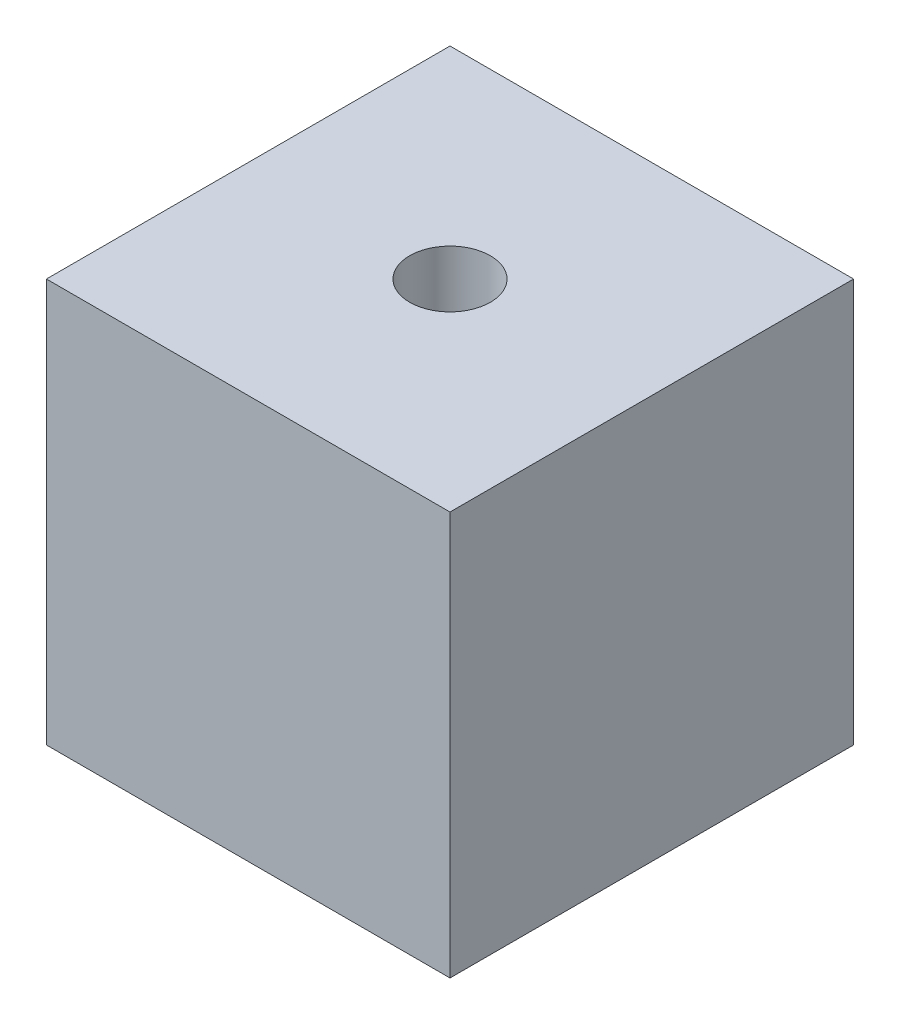
ISO-10303-21;
HEADER;
FILE_DESCRIPTION(('STEP AP214'),'2;1');
FILE_NAME('part.step','',(''),(''),'','','');
FILE_SCHEMA(('AUTOMOTIVE_DESIGN { 1 0 10303 214 1 1 1 1 }'));
ENDSEC;
DATA;
#1=APPLICATION_CONTEXT('core data for automotive mechanical design processes');
#2=APPLICATION_PROTOCOL_DEFINITION('international standard','automotive_design',2000,#1);
#3=PRODUCT_CONTEXT('',#1,'mechanical');
#4=PRODUCT('Part','Part','',(#3));
#5=PRODUCT_RELATED_PRODUCT_CATEGORY('part','',(#4));
#6=PRODUCT_DEFINITION_FORMATION('','',#4);
#7=PRODUCT_DEFINITION_CONTEXT('part definition',#1,'design');
#8=PRODUCT_DEFINITION('design','',#6,#7);
#9=PRODUCT_DEFINITION_SHAPE('','',#8);
#10=(LENGTH_UNIT() NAMED_UNIT(*) SI_UNIT(.MILLI.,.METRE.));
#11=(NAMED_UNIT(*) PLANE_ANGLE_UNIT() SI_UNIT($,.RADIAN.));
#12=(NAMED_UNIT(*) SI_UNIT($,.STERADIAN.) SOLID_ANGLE_UNIT());
#13=UNCERTAINTY_MEASURE_WITH_UNIT(LENGTH_MEASURE(1.E-05),#10,'distance_accuracy_value','');
#14=(GEOMETRIC_REPRESENTATION_CONTEXT(3) GLOBAL_UNCERTAINTY_ASSIGNED_CONTEXT((#13)) GLOBAL_UNIT_ASSIGNED_CONTEXT((#10,
#11,#12)) REPRESENTATION_CONTEXT('',''));
#15=CARTESIAN_POINT('',(0.,0.,0.));
#16=DIRECTION('',(0.,0.,1.));
#17=DIRECTION('',(1.,0.,0.));
#18=AXIS2_PLACEMENT_3D('',#15,#16,#17);
#19=CARTESIAN_POINT('',(-7.5,15.,7.5));
#20=DIRECTION('',(1.,0.,0.));
#21=DIRECTION('',(0.,0.,-1.));
#22=AXIS2_PLACEMENT_3D('',#19,#20,#21);
#23=PLANE('',#22);
#24=DIRECTION('',(0.,0.,1.));
#25=VECTOR('',#24,1.);
#26=CARTESIAN_POINT('',(-7.5,0.,7.5));
#27=LINE('',#26,#25);
#28=CARTESIAN_POINT('',(-7.5,0.,-7.5));
#29=VERTEX_POINT('',#28);
#30=CARTESIAN_POINT('',(-7.5,0.,7.5));
#31=VERTEX_POINT('',#30);
#32=EDGE_CURVE('E94',#29,#31,#27,.T.);
#33=ORIENTED_EDGE('',*,*,#32,.T.);
#34=DIRECTION('',(0.,-1.,0.));
#35=VECTOR('',#34,1.);
#36=CARTESIAN_POINT('',(-7.5,15.,7.5));
#37=LINE('',#36,#35);
#38=CARTESIAN_POINT('',(-7.5,15.,7.5));
#39=VERTEX_POINT('',#38);
#40=EDGE_CURVE('E11',#39,#31,#37,.T.);
#41=ORIENTED_EDGE('',*,*,#40,.F.);
#42=DIRECTION('',(0.,0.,1.));
#43=VECTOR('',#42,1.);
#44=CARTESIAN_POINT('',(-7.5,15.,7.5));
#45=LINE('',#44,#43);
#46=CARTESIAN_POINT('',(-7.5,15.,-7.5));
#47=VERTEX_POINT('',#46);
#48=EDGE_CURVE('E82',#47,#39,#45,.T.);
#49=ORIENTED_EDGE('',*,*,#48,.F.);
#50=DIRECTION('',(0.,-1.,0.));
#51=VECTOR('',#50,1.);
#52=CARTESIAN_POINT('',(-7.5,15.,-7.5));
#53=LINE('',#52,#51);
#54=EDGE_CURVE('E90',#47,#29,#53,.T.);
#55=ORIENTED_EDGE('',*,*,#54,.T.);
#56=EDGE_LOOP('',(#33,#41,#49,#55));
#57=FACE_BOUND('',#56,.T.);
#58=ADVANCED_FACE('F31',(#57),#23,.F.);
#59=CARTESIAN_POINT('',(7.5,15.,7.5));
#60=DIRECTION('',(0.,0.,-1.));
#61=DIRECTION('',(-1.,0.,0.));
#62=AXIS2_PLACEMENT_3D('',#59,#60,#61);
#63=PLANE('',#62);
#64=DIRECTION('',(1.,0.,0.));
#65=VECTOR('',#64,1.);
#66=CARTESIAN_POINT('',(7.5,0.,7.5));
#67=LINE('',#66,#65);
#68=CARTESIAN_POINT('',(7.5,0.,7.5));
#69=VERTEX_POINT('',#68);
#70=EDGE_CURVE('E86',#31,#69,#67,.T.);
#71=ORIENTED_EDGE('',*,*,#70,.T.);
#72=DIRECTION('',(0.,-1.,0.));
#73=VECTOR('',#72,1.);
#74=CARTESIAN_POINT('',(7.5,15.,7.5));
#75=LINE('',#74,#73);
#76=CARTESIAN_POINT('',(7.5,15.,7.5));
#77=VERTEX_POINT('',#76);
#78=EDGE_CURVE('E39',#77,#69,#75,.T.);
#79=ORIENTED_EDGE('',*,*,#78,.F.);
#80=DIRECTION('',(1.,0.,0.));
#81=VECTOR('',#80,1.);
#82=CARTESIAN_POINT('',(7.5,15.,7.5));
#83=LINE('',#82,#81);
#84=EDGE_CURVE('E77',#39,#77,#83,.T.);
#85=ORIENTED_EDGE('',*,*,#84,.F.);
#86=ORIENTED_EDGE('',*,*,#40,.T.);
#87=EDGE_LOOP('',(#71,#79,#85,#86));
#88=FACE_BOUND('',#87,.T.);
#89=ADVANCED_FACE('F85',(#88),#63,.F.);
#90=CARTESIAN_POINT('',(7.5,15.,7.5));
#91=DIRECTION('',(-1.,0.,0.));
#92=DIRECTION('',(0.,0.,1.));
#93=AXIS2_PLACEMENT_3D('',#90,#91,#92);
#94=PLANE('',#93);
#95=DIRECTION('',(0.,0.,-1.));
#96=VECTOR('',#95,1.);
#97=CARTESIAN_POINT('',(7.5,0.,7.5));
#98=LINE('',#97,#96);
#99=CARTESIAN_POINT('',(7.5,0.,-7.5));
#100=VERTEX_POINT('',#99);
#101=EDGE_CURVE('E64',#69,#100,#98,.T.);
#102=ORIENTED_EDGE('',*,*,#101,.T.);
#103=DIRECTION('',(0.,-1.,0.));
#104=VECTOR('',#103,1.);
#105=CARTESIAN_POINT('',(7.5,15.,-7.5));
#106=LINE('',#105,#104);
#107=CARTESIAN_POINT('',(7.5,15.,-7.5));
#108=VERTEX_POINT('',#107);
#109=EDGE_CURVE('E87',#108,#100,#106,.T.);
#110=ORIENTED_EDGE('',*,*,#109,.F.);
#111=DIRECTION('',(0.,0.,-1.));
#112=VECTOR('',#111,1.);
#113=CARTESIAN_POINT('',(7.5,15.,7.5));
#114=LINE('',#113,#112);
#115=EDGE_CURVE('E80',#77,#108,#114,.T.);
#116=ORIENTED_EDGE('',*,*,#115,.F.);
#117=ORIENTED_EDGE('',*,*,#78,.T.);
#118=EDGE_LOOP('',(#102,#110,#116,#117));
#119=FACE_BOUND('',#118,.T.);
#120=ADVANCED_FACE('F88',(#119),#94,.F.);
#121=CARTESIAN_POINT('',(7.5,15.,-7.5));
#122=DIRECTION('',(0.,0.,1.));
#123=DIRECTION('',(1.,0.,0.));
#124=AXIS2_PLACEMENT_3D('',#121,#122,#123);
#125=PLANE('',#124);
#126=DIRECTION('',(-1.,0.,0.));
#127=VECTOR('',#126,1.);
#128=CARTESIAN_POINT('',(7.5,0.,-7.5));
#129=LINE('',#128,#127);
#130=EDGE_CURVE('E70',#100,#29,#129,.T.);
#131=ORIENTED_EDGE('',*,*,#130,.T.);
#132=ORIENTED_EDGE('',*,*,#54,.F.);
#133=DIRECTION('',(-1.,0.,0.));
#134=VECTOR('',#133,1.);
#135=CARTESIAN_POINT('',(7.5,15.,-7.5));
#136=LINE('',#135,#134);
#137=EDGE_CURVE('E47',#108,#47,#136,.T.);
#138=ORIENTED_EDGE('',*,*,#137,.F.);
#139=ORIENTED_EDGE('',*,*,#109,.T.);
#140=EDGE_LOOP('',(#131,#132,#138,#139));
#141=FACE_BOUND('',#140,.T.);
#142=ADVANCED_FACE('F102',(#141),#125,.F.);
#143=CARTESIAN_POINT('',(-7.5,15.,-7.5));
#144=DIRECTION('',(0.,1.,0.));
#145=DIRECTION('',(0.,0.,1.));
#146=AXIS2_PLACEMENT_3D('',#143,#144,#145);
#147=PLANE('',#146);
#148=CARTESIAN_POINT('',(0.,15.,0.));
#149=DIRECTION('',(0.,1.,0.));
#150=DIRECTION('',(0.,0.,1.));
#151=AXIS2_PLACEMENT_3D('',#148,#149,#150);
#152=CIRCLE('',#151,1.5);
#153=CARTESIAN_POINT('',(0.,15.,1.5));
#154=VERTEX_POINT('',#153);
#155=EDGE_CURVE('E108',#154,#154,#152,.T.);
#156=ORIENTED_EDGE('',*,*,#155,.F.);
#157=EDGE_LOOP('',(#156));
#158=FACE_BOUND('',#157,.T.);
#159=ORIENTED_EDGE('',*,*,#48,.T.);
#160=ORIENTED_EDGE('',*,*,#84,.T.);
#161=ORIENTED_EDGE('',*,*,#115,.T.);
#162=ORIENTED_EDGE('',*,*,#137,.T.);
#163=EDGE_LOOP('',(#159,#160,#161,#162));
#164=FACE_BOUND('',#163,.T.);
#165=ADVANCED_FACE('F78',(#158,#164),#147,.T.);
#166=CARTESIAN_POINT('',(-7.5,0.,-7.5));
#167=DIRECTION('',(0.,1.,0.));
#168=DIRECTION('',(0.,0.,1.));
#169=AXIS2_PLACEMENT_3D('',#166,#167,#168);
#170=PLANE('',#169);
#171=CARTESIAN_POINT('',(0.,0.,0.));
#172=DIRECTION('',(0.,1.,0.));
#173=DIRECTION('',(0.,0.,1.));
#174=AXIS2_PLACEMENT_3D('',#171,#172,#173);
#175=CIRCLE('',#174,1.5);
#176=CARTESIAN_POINT('',(0.,0.,1.5));
#177=VERTEX_POINT('',#176);
#178=EDGE_CURVE('E97',#177,#177,#175,.T.);
#179=ORIENTED_EDGE('',*,*,#178,.T.);
#180=EDGE_LOOP('',(#179));
#181=FACE_BOUND('',#180,.T.);
#182=ORIENTED_EDGE('',*,*,#32,.F.);
#183=ORIENTED_EDGE('',*,*,#130,.F.);
#184=ORIENTED_EDGE('',*,*,#101,.F.);
#185=ORIENTED_EDGE('',*,*,#70,.F.);
#186=EDGE_LOOP('',(#182,#183,#184,#185));
#187=FACE_BOUND('',#186,.T.);
#188=ADVANCED_FACE('F105',(#181,#187),#170,.F.);
#189=CARTESIAN_POINT('',(0.,0.,0.));
#190=DIRECTION('',(0.,1.,0.));
#191=DIRECTION('',(0.,0.,1.));
#192=AXIS2_PLACEMENT_3D('',#189,#190,#191);
#193=CYLINDRICAL_SURFACE('',#192,1.5);
#194=ORIENTED_EDGE('',*,*,#178,.F.);
#195=EDGE_LOOP('',(#194));
#196=FACE_BOUND('',#195,.T.);
#197=ORIENTED_EDGE('',*,*,#155,.T.);
#198=EDGE_LOOP('',(#197));
#199=FACE_BOUND('',#198,.T.);
#200=ADVANCED_FACE('F115',(#196,#199),#193,.F.);
#201=CLOSED_SHELL('',(#58,#89,#120,#142,#165,#188,#200));
#202=MANIFOLD_SOLID_BREP('B2',#201);
#203=ADVANCED_BREP_SHAPE_REPRESENTATION('',(#18,#202),#14);
#204=SHAPE_DEFINITION_REPRESENTATION(#9,#203);
ENDSEC;
END-ISO-10303-21;
